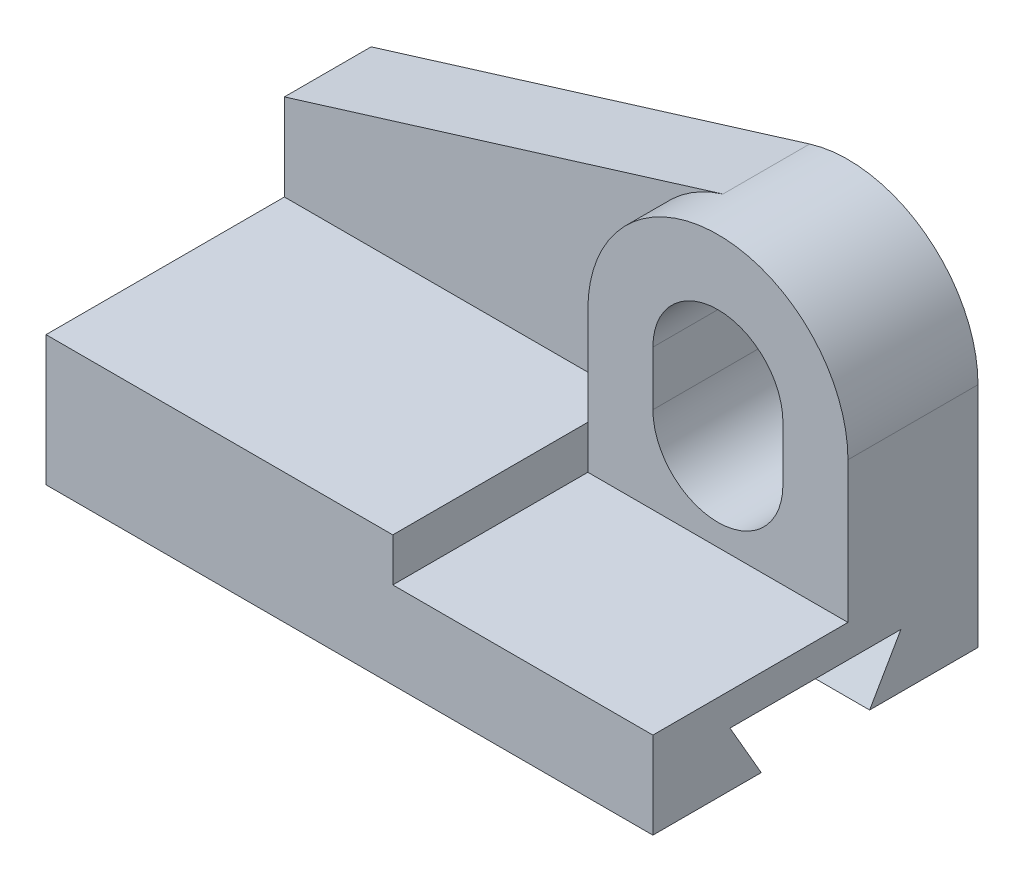
ISO-10303-21;
HEADER;
FILE_DESCRIPTION(('STEP AP214'),'2;1');
FILE_NAME('part.step','',(''),(''),'','','');
FILE_SCHEMA(('AUTOMOTIVE_DESIGN { 1 0 10303 214 1 1 1 1 }'));
ENDSEC;
DATA;
#1=APPLICATION_CONTEXT('core data for automotive mechanical design processes');
#2=APPLICATION_PROTOCOL_DEFINITION('international standard','automotive_design',2000,#1);
#3=PRODUCT_CONTEXT('',#1,'mechanical');
#4=PRODUCT('Part','Part','',(#3));
#5=PRODUCT_RELATED_PRODUCT_CATEGORY('part','',(#4));
#6=PRODUCT_DEFINITION_FORMATION('','',#4);
#7=PRODUCT_DEFINITION_CONTEXT('part definition',#1,'design');
#8=PRODUCT_DEFINITION('design','',#6,#7);
#9=PRODUCT_DEFINITION_SHAPE('','',#8);
#10=(LENGTH_UNIT() NAMED_UNIT(*) SI_UNIT(.MILLI.,.METRE.));
#11=(NAMED_UNIT(*) PLANE_ANGLE_UNIT() SI_UNIT($,.RADIAN.));
#12=(NAMED_UNIT(*) SI_UNIT($,.STERADIAN.) SOLID_ANGLE_UNIT());
#13=UNCERTAINTY_MEASURE_WITH_UNIT(LENGTH_MEASURE(1.E-05),#10,'distance_accuracy_value','');
#14=(GEOMETRIC_REPRESENTATION_CONTEXT(3) GLOBAL_UNCERTAINTY_ASSIGNED_CONTEXT((#13)) GLOBAL_UNIT_ASSIGNED_CONTEXT((#10,
#11,#12)) REPRESENTATION_CONTEXT('',''));
#15=CARTESIAN_POINT('',(0.,0.,0.));
#16=DIRECTION('',(0.,0.,1.));
#17=DIRECTION('',(1.,0.,0.));
#18=AXIS2_PLACEMENT_3D('',#15,#16,#17);
#19=CARTESIAN_POINT('',(0.,-10.,-8.));
#20=DIRECTION('',(0.,1.,0.));
#21=DIRECTION('',(-1.,0.,0.));
#22=AXIS2_PLACEMENT_3D('',#19,#20,#21);
#23=PLANE('',#22);
#24=DIRECTION('',(0.,0.,1.));
#25=VECTOR('',#24,1.);
#26=CARTESIAN_POINT('',(28.4071767656035,-9.99999999999999,-8.));
#27=LINE('',#26,#25);
#28=CARTESIAN_POINT('',(28.4071767656035,-9.99999999999999,-8.));
#29=VERTEX_POINT('',#28);
#30=CARTESIAN_POINT('',(28.4071767656035,-9.99999999999998,2.));
#31=VERTEX_POINT('',#30);
#32=EDGE_CURVE('E47',#29,#31,#27,.T.);
#33=ORIENTED_EDGE('',*,*,#32,.T.);
#34=DIRECTION('',(-1.,0.,0.));
#35=VECTOR('',#34,1.);
#36=CARTESIAN_POINT('',(28.4071767656035,-9.99999999999998,2.));
#37=LINE('',#36,#35);
#38=CARTESIAN_POINT('',(-27.5928232343965,-10.,2.));
#39=VERTEX_POINT('',#38);
#40=EDGE_CURVE('E336',#31,#39,#37,.T.);
#41=ORIENTED_EDGE('',*,*,#40,.T.);
#42=DIRECTION('',(0.,0.,1.));
#43=VECTOR('',#42,1.);
#44=CARTESIAN_POINT('',(-27.5928232343965,-10.,-8.));
#45=LINE('',#44,#43);
#46=CARTESIAN_POINT('',(-27.5928232343965,-10.,-8.));
#47=VERTEX_POINT('',#46);
#48=EDGE_CURVE('E221',#47,#39,#45,.T.);
#49=ORIENTED_EDGE('',*,*,#48,.F.);
#50=DIRECTION('',(-1.,0.,0.));
#51=VECTOR('',#50,1.);
#52=CARTESIAN_POINT('',(0.,-10.,-8.));
#53=LINE('',#52,#51);
#54=EDGE_CURVE('E213',#29,#47,#53,.T.);
#55=ORIENTED_EDGE('',*,*,#54,.F.);
#56=EDGE_LOOP('',(#33,#41,#49,#55));
#57=FACE_BOUND('',#56,.T.);
#58=ADVANCED_FACE('F43',(#57),#23,.F.);
#59=CARTESIAN_POINT('',(0.,0.,0.));
#60=DIRECTION('',(0.,0.,1.));
#61=DIRECTION('',(1.,0.,0.));
#62=AXIS2_PLACEMENT_3D('',#59,#60,#61);
#63=PLANE('',#62);
#64=DIRECTION('',(0.,1.,0.));
#65=VECTOR('',#64,1.);
#66=CARTESIAN_POINT('',(-27.5928232343965,0.,0.));
#67=LINE('',#66,#65);
#68=CARTESIAN_POINT('',(-27.5928232343965,2.,0.));
#69=VERTEX_POINT('',#68);
#70=CARTESIAN_POINT('',(-27.5928232343965,10.,0.));
#71=VERTEX_POINT('',#70);
#72=EDGE_CURVE('E210',#69,#71,#67,.T.);
#73=ORIENTED_EDGE('',*,*,#72,.F.);
#74=DIRECTION('',(-1.,0.,0.));
#75=VECTOR('',#74,1.);
#76=CARTESIAN_POINT('',(0.,2.,0.));
#77=LINE('',#76,#75);
#78=CARTESIAN_POINT('',(4.40717676560348,2.,0.));
#79=VERTEX_POINT('',#78);
#80=EDGE_CURVE('E313',#79,#69,#77,.T.);
#81=ORIENTED_EDGE('',*,*,#80,.F.);
#82=DIRECTION('',(0.,-1.,0.));
#83=VECTOR('',#82,1.);
#84=CARTESIAN_POINT('',(4.40717676560348,0.,0.));
#85=LINE('',#84,#83);
#86=CARTESIAN_POINT('',(4.40717676560348,10.9999999999999,0.));
#87=VERTEX_POINT('',#86);
#88=EDGE_CURVE('E68',#87,#79,#85,.T.);
#89=ORIENTED_EDGE('',*,*,#88,.F.);
#90=CARTESIAN_POINT('',(16.4071767656035,11.,0.));
#91=DIRECTION('',(0.,0.,1.));
#92=DIRECTION('',(1.,0.,0.));
#93=AXIS2_PLACEMENT_3D('',#90,#91,#92);
#94=CIRCLE('',#93,12.);
#95=CARTESIAN_POINT('',(12.8738128169025,22.4680137428423,0.));
#96=VERTEX_POINT('',#95);
#97=EDGE_CURVE('E11',#96,#87,#94,.T.);
#98=ORIENTED_EDGE('',*,*,#97,.F.);
#99=DIRECTION('',(0.955667811903527,0.29444699572508,0.));
#100=VECTOR('',#99,1.);
#101=CARTESIAN_POINT('',(-5.20620626146767,16.897451216859,0.));
#102=LINE('',#101,#100);
#103=EDGE_CURVE('E207',#71,#96,#102,.T.);
#104=ORIENTED_EDGE('',*,*,#103,.F.);
#105=EDGE_LOOP('',(#73,#81,#89,#98,#104));
#106=FACE_BOUND('',#105,.T.);
#107=ADVANCED_FACE('F358',(#106),#63,.T.);
#108=CARTESIAN_POINT('',(4.40717676560348,0.,4.));
#109=DIRECTION('',(1.,0.,0.));
#110=DIRECTION('',(0.,0.,-1.));
#111=AXIS2_PLACEMENT_3D('',#108,#109,#110);
#112=PLANE('',#111);
#113=DIRECTION('',(0.,0.,-1.));
#114=VECTOR('',#113,1.);
#115=CARTESIAN_POINT('',(4.40717676560348,2.,22.));
#116=LINE('',#115,#114);
#117=CARTESIAN_POINT('',(4.40717676560348,2.,4.));
#118=VERTEX_POINT('',#117);
#119=EDGE_CURVE('E304',#118,#79,#116,.T.);
#120=ORIENTED_EDGE('',*,*,#119,.F.);
#121=DIRECTION('',(0.,-1.,0.));
#122=VECTOR('',#121,1.);
#123=CARTESIAN_POINT('',(4.40717676560348,0.,4.));
#124=LINE('',#123,#122);
#125=CARTESIAN_POINT('',(4.40717676560348,10.9999999999999,4.));
#126=VERTEX_POINT('',#125);
#127=EDGE_CURVE('E254',#126,#118,#124,.T.);
#128=ORIENTED_EDGE('',*,*,#127,.F.);
#129=DIRECTION('',(0.,0.,-1.));
#130=VECTOR('',#129,1.);
#131=CARTESIAN_POINT('',(4.40717676560348,10.9999999999999,4.));
#132=LINE('',#131,#130);
#133=EDGE_CURVE('E211',#126,#87,#132,.T.);
#134=ORIENTED_EDGE('',*,*,#133,.T.);
#135=ORIENTED_EDGE('',*,*,#88,.T.);
#136=EDGE_LOOP('',(#120,#128,#134,#135));
#137=FACE_BOUND('',#136,.T.);
#138=ADVANCED_FACE('F368',(#137),#112,.F.);
#139=CARTESIAN_POINT('',(16.4071767656035,6.,-8.));
#140=DIRECTION('',(0.,0.,1.));
#141=DIRECTION('',(1.,0.,0.));
#142=AXIS2_PLACEMENT_3D('',#139,#140,#141);
#143=CYLINDRICAL_SURFACE('',#142,6.);
#144=DIRECTION('',(0.,0.,1.));
#145=VECTOR('',#144,1.);
#146=CARTESIAN_POINT('',(10.4071767656035,6.,-8.));
#147=LINE('',#146,#145);
#148=CARTESIAN_POINT('',(10.4071767656035,6.,-8.));
#149=VERTEX_POINT('',#148);
#150=CARTESIAN_POINT('',(10.4071767656035,6.,4.));
#151=VERTEX_POINT('',#150);
#152=EDGE_CURVE('E219',#149,#151,#147,.T.);
#153=ORIENTED_EDGE('',*,*,#152,.T.);
#154=CARTESIAN_POINT('',(16.4071767656035,6.,4.));
#155=DIRECTION('',(0.,0.,1.));
#156=DIRECTION('',(1.,0.,0.));
#157=AXIS2_PLACEMENT_3D('',#154,#155,#156);
#158=CIRCLE('',#157,6.);
#159=CARTESIAN_POINT('',(22.4071767656035,6.,4.));
#160=VERTEX_POINT('',#159);
#161=EDGE_CURVE('E263',#151,#160,#158,.T.);
#162=ORIENTED_EDGE('',*,*,#161,.T.);
#163=DIRECTION('',(0.,0.,1.));
#164=VECTOR('',#163,1.);
#165=CARTESIAN_POINT('',(22.4071767656035,6.,-8.));
#166=LINE('',#165,#164);
#167=CARTESIAN_POINT('',(22.4071767656035,6.,-8.));
#168=VERTEX_POINT('',#167);
#169=EDGE_CURVE('E52',#168,#160,#166,.T.);
#170=ORIENTED_EDGE('',*,*,#169,.F.);
#171=CARTESIAN_POINT('',(16.4071767656035,6.,-8.));
#172=DIRECTION('',(0.,0.,1.));
#173=DIRECTION('',(1.,0.,0.));
#174=AXIS2_PLACEMENT_3D('',#171,#172,#173);
#175=CIRCLE('',#174,6.);
#176=EDGE_CURVE('E275',#149,#168,#175,.T.);
#177=ORIENTED_EDGE('',*,*,#176,.F.);
#178=EDGE_LOOP('',(#153,#162,#170,#177));
#179=FACE_BOUND('',#178,.T.);
#180=ADVANCED_FACE('F292',(#179),#143,.F.);
#181=CARTESIAN_POINT('',(22.4071767656035,0.,-8.));
#182=DIRECTION('',(-1.,0.,0.));
#183=DIRECTION('',(0.,-1.,0.));
#184=AXIS2_PLACEMENT_3D('',#181,#182,#183);
#185=PLANE('',#184);
#186=ORIENTED_EDGE('',*,*,#169,.T.);
#187=DIRECTION('',(0.,-1.,0.));
#188=VECTOR('',#187,1.);
#189=CARTESIAN_POINT('',(22.4071767656035,0.,4.));
#190=LINE('',#189,#188);
#191=CARTESIAN_POINT('',(22.4071767656035,11.,4.));
#192=VERTEX_POINT('',#191);
#193=EDGE_CURVE('E252',#192,#160,#190,.T.);
#194=ORIENTED_EDGE('',*,*,#193,.F.);
#195=DIRECTION('',(0.,0.,1.));
#196=VECTOR('',#195,1.);
#197=CARTESIAN_POINT('',(22.4071767656035,11.,-8.));
#198=LINE('',#197,#196);
#199=CARTESIAN_POINT('',(22.4071767656035,11.,-8.));
#200=VERTEX_POINT('',#199);
#201=EDGE_CURVE('E215',#200,#192,#198,.T.);
#202=ORIENTED_EDGE('',*,*,#201,.F.);
#203=DIRECTION('',(0.,-1.,0.));
#204=VECTOR('',#203,1.);
#205=CARTESIAN_POINT('',(22.4071767656035,0.,-8.));
#206=LINE('',#205,#204);
#207=EDGE_CURVE('E195',#200,#168,#206,.T.);
#208=ORIENTED_EDGE('',*,*,#207,.T.);
#209=EDGE_LOOP('',(#186,#194,#202,#208));
#210=FACE_BOUND('',#209,.T.);
#211=ADVANCED_FACE('F294',(#210),#185,.T.);
#212=CARTESIAN_POINT('',(16.4071767656035,11.,-8.));
#213=DIRECTION('',(0.,0.,1.));
#214=DIRECTION('',(1.,0.,0.));
#215=AXIS2_PLACEMENT_3D('',#212,#213,#214);
#216=CYLINDRICAL_SURFACE('',#215,6.00000000000001);
#217=ORIENTED_EDGE('',*,*,#201,.T.);
#218=CARTESIAN_POINT('',(16.4071767656035,11.,4.));
#219=DIRECTION('',(0.,0.,1.));
#220=DIRECTION('',(1.,0.,0.));
#221=AXIS2_PLACEMENT_3D('',#218,#219,#220);
#222=CIRCLE('',#221,6.00000000000001);
#223=CARTESIAN_POINT('',(10.4071767656035,11.,4.));
#224=VERTEX_POINT('',#223);
#225=EDGE_CURVE('E257',#192,#224,#222,.T.);
#226=ORIENTED_EDGE('',*,*,#225,.T.);
#227=DIRECTION('',(0.,0.,1.));
#228=VECTOR('',#227,1.);
#229=CARTESIAN_POINT('',(10.4071767656035,11.,-8.));
#230=LINE('',#229,#228);
#231=CARTESIAN_POINT('',(10.4071767656035,11.,-8.));
#232=VERTEX_POINT('',#231);
#233=EDGE_CURVE('E217',#232,#224,#230,.T.);
#234=ORIENTED_EDGE('',*,*,#233,.F.);
#235=CARTESIAN_POINT('',(16.4071767656035,11.,-8.));
#236=DIRECTION('',(0.,0.,1.));
#237=DIRECTION('',(1.,0.,0.));
#238=AXIS2_PLACEMENT_3D('',#235,#236,#237);
#239=CIRCLE('',#238,6.00000000000001);
#240=EDGE_CURVE('E199',#200,#232,#239,.T.);
#241=ORIENTED_EDGE('',*,*,#240,.F.);
#242=EDGE_LOOP('',(#217,#226,#234,#241));
#243=FACE_BOUND('',#242,.T.);
#244=ADVANCED_FACE('F394',(#243),#216,.F.);
#245=CARTESIAN_POINT('',(-27.5928232343965,-10.,12.));
#246=VERTEX_POINT('',#245);
#247=CARTESIAN_POINT('',(-27.5928232343965,-10.,22.));
#248=VERTEX_POINT('',#247);
#249=EDGE_CURVE('E187',#246,#248,#45,.T.);
#250=ORIENTED_EDGE('',*,*,#249,.F.);
#251=DIRECTION('',(-1.,0.,0.));
#252=VECTOR('',#251,1.);
#253=CARTESIAN_POINT('',(28.4071767656035,-9.99999999999998,12.));
#254=LINE('',#253,#252);
#255=CARTESIAN_POINT('',(28.4071767656035,-9.99999999999998,12.));
#256=VERTEX_POINT('',#255);
#257=EDGE_CURVE('E176',#256,#246,#254,.T.);
#258=ORIENTED_EDGE('',*,*,#257,.F.);
#259=CARTESIAN_POINT('',(28.4071767656035,-9.99999999999999,22.));
#260=VERTEX_POINT('',#259);
#261=EDGE_CURVE('E185',#256,#260,#27,.T.);
#262=ORIENTED_EDGE('',*,*,#261,.T.);
#263=DIRECTION('',(-1.,0.,0.));
#264=VECTOR('',#263,1.);
#265=CARTESIAN_POINT('',(0.,-10.,22.));
#266=LINE('',#265,#264);
#267=EDGE_CURVE('E321',#260,#248,#266,.T.);
#268=ORIENTED_EDGE('',*,*,#267,.T.);
#269=EDGE_LOOP('',(#250,#258,#262,#268));
#270=FACE_BOUND('',#269,.T.);
#271=ADVANCED_FACE('F45',(#270),#23,.F.);
#272=CARTESIAN_POINT('',(-27.5928232343965,0.,-8.));
#273=DIRECTION('',(1.,0.,0.));
#274=DIRECTION('',(0.,1.,0.));
#275=AXIS2_PLACEMENT_3D('',#272,#273,#274);
#276=PLANE('',#275);
#277=ORIENTED_EDGE('',*,*,#48,.T.);
#278=DIRECTION('',(0.,0.866025403784436,-0.500000000000004));
#279=VECTOR('',#278,1.);
#280=CARTESIAN_POINT('',(-27.5928232343965,1.83012701892217,-4.83012701892226));
#281=LINE('',#280,#279);
#282=CARTESIAN_POINT('',(-27.5928232343965,-5.,-0.886751345948162));
#283=VERTEX_POINT('',#282);
#284=EDGE_CURVE('E317',#39,#283,#281,.T.);
#285=ORIENTED_EDGE('',*,*,#284,.T.);
#286=DIRECTION('',(0.,0.,1.));
#287=VECTOR('',#286,1.);
#288=CARTESIAN_POINT('',(-27.5928232343965,-5.,-8.));
#289=LINE('',#288,#287);
#290=CARTESIAN_POINT('',(-27.5928232343965,-5.,14.8867513459482));
#291=VERTEX_POINT('',#290);
#292=EDGE_CURVE('E332',#283,#291,#289,.T.);
#293=ORIENTED_EDGE('',*,*,#292,.T.);
#294=DIRECTION('',(0.,-0.866025403784436,-0.500000000000004));
#295=VECTOR('',#294,1.);
#296=CARTESIAN_POINT('',(-27.5928232343965,-11.1602540378445,11.3301270189221));
#297=LINE('',#296,#295);
#298=EDGE_CURVE('E335',#291,#246,#297,.T.);
#299=ORIENTED_EDGE('',*,*,#298,.T.);
#300=ORIENTED_EDGE('',*,*,#249,.T.);
#301=DIRECTION('',(0.,1.,0.));
#302=VECTOR('',#301,1.);
#303=CARTESIAN_POINT('',(-27.5928232343965,0.,22.));
#304=LINE('',#303,#302);
#305=CARTESIAN_POINT('',(-27.5928232343965,2.,22.));
#306=VERTEX_POINT('',#305);
#307=EDGE_CURVE('E323',#248,#306,#304,.T.);
#308=ORIENTED_EDGE('',*,*,#307,.T.);
#309=DIRECTION('',(0.,0.,-1.));
#310=VECTOR('',#309,1.);
#311=CARTESIAN_POINT('',(-27.5928232343965,2.,22.));
#312=LINE('',#311,#310);
#313=EDGE_CURVE('E305',#306,#69,#312,.T.);
#314=ORIENTED_EDGE('',*,*,#313,.T.);
#315=ORIENTED_EDGE('',*,*,#72,.T.);
#316=DIRECTION('',(0.,0.,1.));
#317=VECTOR('',#316,1.);
#318=CARTESIAN_POINT('',(-27.5928232343965,10.,-8.));
#319=LINE('',#318,#317);
#320=CARTESIAN_POINT('',(-27.5928232343965,10.,-8.));
#321=VERTEX_POINT('',#320);
#322=EDGE_CURVE('E224',#321,#71,#319,.T.);
#323=ORIENTED_EDGE('',*,*,#322,.F.);
#324=DIRECTION('',(0.,1.,0.));
#325=VECTOR('',#324,1.);
#326=CARTESIAN_POINT('',(-27.5928232343965,0.,-8.));
#327=LINE('',#326,#325);
#328=EDGE_CURVE('E273',#47,#321,#327,.T.);
#329=ORIENTED_EDGE('',*,*,#328,.F.);
#330=EDGE_LOOP('',(#277,#285,#293,#299,#300,#308,#314,#315,#323,#329));
#331=FACE_BOUND('',#330,.T.);
#332=ADVANCED_FACE('F360',(#331),#276,.F.);
#333=CARTESIAN_POINT('',(-5.20620626146767,16.897451216859,-8.));
#334=DIRECTION('',(0.29444699572508,-0.955667811903527,0.));
#335=DIRECTION('',(0.955667811903527,0.29444699572508,0.));
#336=AXIS2_PLACEMENT_3D('',#333,#334,#335);
#337=PLANE('',#336);
#338=ORIENTED_EDGE('',*,*,#103,.T.);
#339=DIRECTION('',(0.,0.,1.));
#340=VECTOR('',#339,1.);
#341=CARTESIAN_POINT('',(12.8738128169025,22.4680137428423,-8.));
#342=LINE('',#341,#340);
#343=CARTESIAN_POINT('',(12.8738128169025,22.4680137428423,-8.));
#344=VERTEX_POINT('',#343);
#345=EDGE_CURVE('E227',#344,#96,#342,.T.);
#346=ORIENTED_EDGE('',*,*,#345,.F.);
#347=DIRECTION('',(0.955667811903527,0.29444699572508,0.));
#348=VECTOR('',#347,1.);
#349=CARTESIAN_POINT('',(-5.20620626146767,16.897451216859,-8.));
#350=LINE('',#349,#348);
#351=EDGE_CURVE('E271',#321,#344,#350,.T.);
#352=ORIENTED_EDGE('',*,*,#351,.F.);
#353=ORIENTED_EDGE('',*,*,#322,.T.);
#354=EDGE_LOOP('',(#338,#346,#352,#353));
#355=FACE_BOUND('',#354,.T.);
#356=ADVANCED_FACE('F355',(#355),#337,.F.);
#357=CARTESIAN_POINT('',(16.4071767656035,11.,-8.));
#358=DIRECTION('',(0.,0.,1.));
#359=DIRECTION('',(1.,0.,0.));
#360=AXIS2_PLACEMENT_3D('',#357,#358,#359);
#361=CYLINDRICAL_SURFACE('',#360,12.);
#362=ORIENTED_EDGE('',*,*,#345,.T.);
#363=ORIENTED_EDGE('',*,*,#97,.T.);
#364=ORIENTED_EDGE('',*,*,#133,.F.);
#365=CARTESIAN_POINT('',(16.4071767656035,11.,4.));
#366=DIRECTION('',(0.,0.,1.));
#367=DIRECTION('',(1.,0.,0.));
#368=AXIS2_PLACEMENT_3D('',#365,#366,#367);
#369=CIRCLE('',#368,12.);
#370=CARTESIAN_POINT('',(28.4071767656035,11.,4.));
#371=VERTEX_POINT('',#370);
#372=EDGE_CURVE('E244',#371,#126,#369,.T.);
#373=ORIENTED_EDGE('',*,*,#372,.F.);
#374=DIRECTION('',(0.,0.,1.));
#375=VECTOR('',#374,1.);
#376=CARTESIAN_POINT('',(28.4071767656035,11.,-8.));
#377=LINE('',#376,#375);
#378=CARTESIAN_POINT('',(28.4071767656035,11.,-8.));
#379=VERTEX_POINT('',#378);
#380=EDGE_CURVE('E197',#379,#371,#377,.T.);
#381=ORIENTED_EDGE('',*,*,#380,.F.);
#382=CARTESIAN_POINT('',(16.4071767656035,11.,-8.));
#383=DIRECTION('',(0.,0.,1.));
#384=DIRECTION('',(1.,0.,0.));
#385=AXIS2_PLACEMENT_3D('',#382,#383,#384);
#386=CIRCLE('',#385,12.);
#387=EDGE_CURVE('E269',#379,#344,#386,.T.);
#388=ORIENTED_EDGE('',*,*,#387,.T.);
#389=EDGE_LOOP('',(#362,#363,#364,#373,#381,#388));
#390=FACE_BOUND('',#389,.T.);
#391=ADVANCED_FACE('F249',(#390),#361,.T.);
#392=CARTESIAN_POINT('',(28.4071767656035,0.,-8.));
#393=DIRECTION('',(1.,0.,0.));
#394=DIRECTION('',(0.,1.,0.));
#395=AXIS2_PLACEMENT_3D('',#392,#393,#394);
#396=PLANE('',#395);
#397=DIRECTION('',(0.,-0.866025403784436,0.500000000000004));
#398=VECTOR('',#397,1.);
#399=CARTESIAN_POINT('',(28.4071767656035,-9.99999999999998,2.));
#400=LINE('',#399,#398);
#401=CARTESIAN_POINT('',(28.4071767656035,-4.99999999999998,-0.886751345948162));
#402=VERTEX_POINT('',#401);
#403=EDGE_CURVE('E188',#402,#31,#400,.T.);
#404=ORIENTED_EDGE('',*,*,#403,.T.);
#405=ORIENTED_EDGE('',*,*,#32,.F.);
#406=DIRECTION('',(0.,1.,0.));
#407=VECTOR('',#406,1.);
#408=CARTESIAN_POINT('',(28.4071767656035,0.,-8.));
#409=LINE('',#408,#407);
#410=EDGE_CURVE('E234',#29,#379,#409,.T.);
#411=ORIENTED_EDGE('',*,*,#410,.T.);
#412=ORIENTED_EDGE('',*,*,#380,.T.);
#413=DIRECTION('',(0.,1.,0.));
#414=VECTOR('',#413,1.);
#415=CARTESIAN_POINT('',(28.4071767656035,0.,4.));
#416=LINE('',#415,#414);
#417=CARTESIAN_POINT('',(28.4071767656035,-2.00000000000008,4.));
#418=VERTEX_POINT('',#417);
#419=EDGE_CURVE('E232',#418,#371,#416,.T.);
#420=ORIENTED_EDGE('',*,*,#419,.F.);
#421=DIRECTION('',(0.,0.,-1.));
#422=VECTOR('',#421,1.);
#423=CARTESIAN_POINT('',(28.4071767656035,-2.00000000000008,22.));
#424=LINE('',#423,#422);
#425=CARTESIAN_POINT('',(28.4071767656035,-2.00000000000008,22.));
#426=VERTEX_POINT('',#425);
#427=EDGE_CURVE('E307',#426,#418,#424,.T.);
#428=ORIENTED_EDGE('',*,*,#427,.F.);
#429=DIRECTION('',(0.,1.,0.));
#430=VECTOR('',#429,1.);
#431=CARTESIAN_POINT('',(28.4071767656035,0.,22.));
#432=LINE('',#431,#430);
#433=EDGE_CURVE('E193',#260,#426,#432,.T.);
#434=ORIENTED_EDGE('',*,*,#433,.F.);
#435=ORIENTED_EDGE('',*,*,#261,.F.);
#436=DIRECTION('',(0.,0.866025403784436,0.500000000000004));
#437=VECTOR('',#436,1.);
#438=CARTESIAN_POINT('',(28.4071767656035,-9.99999999999998,12.));
#439=LINE('',#438,#437);
#440=CARTESIAN_POINT('',(28.4071767656035,-4.99999999999998,14.8867513459482));
#441=VERTEX_POINT('',#440);
#442=EDGE_CURVE('E173',#256,#441,#439,.T.);
#443=ORIENTED_EDGE('',*,*,#442,.T.);
#444=DIRECTION('',(0.,0.,-1.));
#445=VECTOR('',#444,1.);
#446=CARTESIAN_POINT('',(28.4071767656035,-4.99999999999998,-0.886751345948162));
#447=LINE('',#446,#445);
#448=EDGE_CURVE('E60',#441,#402,#447,.T.);
#449=ORIENTED_EDGE('',*,*,#448,.T.);
#450=EDGE_LOOP('',(#404,#405,#411,#412,#420,#428,#434,#435,#443,#449));
#451=FACE_BOUND('',#450,.T.);
#452=ADVANCED_FACE('F191',(#451),#396,.T.);
#453=CARTESIAN_POINT('',(10.4071767656035,0.,-8.));
#454=DIRECTION('',(-1.,0.,0.));
#455=DIRECTION('',(0.,-1.,0.));
#456=AXIS2_PLACEMENT_3D('',#453,#454,#455);
#457=PLANE('',#456);
#458=ORIENTED_EDGE('',*,*,#233,.T.);
#459=DIRECTION('',(0.,-1.,0.));
#460=VECTOR('',#459,1.);
#461=CARTESIAN_POINT('',(10.4071767656035,0.,4.));
#462=LINE('',#461,#460);
#463=EDGE_CURVE('E288',#224,#151,#462,.T.);
#464=ORIENTED_EDGE('',*,*,#463,.T.);
#465=ORIENTED_EDGE('',*,*,#152,.F.);
#466=DIRECTION('',(0.,-1.,0.));
#467=VECTOR('',#466,1.);
#468=CARTESIAN_POINT('',(10.4071767656035,0.,-8.));
#469=LINE('',#468,#467);
#470=EDGE_CURVE('E203',#232,#149,#469,.T.);
#471=ORIENTED_EDGE('',*,*,#470,.F.);
#472=EDGE_LOOP('',(#458,#464,#465,#471));
#473=FACE_BOUND('',#472,.T.);
#474=ADVANCED_FACE('F286',(#473),#457,.F.);
#475=CARTESIAN_POINT('',(0.,0.,-8.));
#476=DIRECTION('',(0.,0.,1.));
#477=DIRECTION('',(1.,0.,0.));
#478=AXIS2_PLACEMENT_3D('',#475,#476,#477);
#479=PLANE('',#478);
#480=ORIENTED_EDGE('',*,*,#54,.T.);
#481=ORIENTED_EDGE('',*,*,#328,.T.);
#482=ORIENTED_EDGE('',*,*,#351,.T.);
#483=ORIENTED_EDGE('',*,*,#387,.F.);
#484=ORIENTED_EDGE('',*,*,#410,.F.);
#485=EDGE_LOOP('',(#480,#481,#482,#483,#484));
#486=FACE_BOUND('',#485,.T.);
#487=ORIENTED_EDGE('',*,*,#176,.T.);
#488=ORIENTED_EDGE('',*,*,#207,.F.);
#489=ORIENTED_EDGE('',*,*,#240,.T.);
#490=ORIENTED_EDGE('',*,*,#470,.T.);
#491=EDGE_LOOP('',(#487,#488,#489,#490));
#492=FACE_BOUND('',#491,.T.);
#493=ADVANCED_FACE('F279',(#486,#492),#479,.F.);
#494=CARTESIAN_POINT('',(0.,0.,4.));
#495=DIRECTION('',(0.,0.,1.));
#496=DIRECTION('',(1.,0.,0.));
#497=AXIS2_PLACEMENT_3D('',#494,#495,#496);
#498=PLANE('',#497);
#499=ORIENTED_EDGE('',*,*,#161,.F.);
#500=ORIENTED_EDGE('',*,*,#463,.F.);
#501=ORIENTED_EDGE('',*,*,#225,.F.);
#502=ORIENTED_EDGE('',*,*,#193,.T.);
#503=EDGE_LOOP('',(#499,#500,#501,#502));
#504=FACE_BOUND('',#503,.T.);
#505=ORIENTED_EDGE('',*,*,#372,.T.);
#506=ORIENTED_EDGE('',*,*,#127,.T.);
#507=CARTESIAN_POINT('',(4.40717676560348,-2.00000000000008,4.));
#508=VERTEX_POINT('',#507);
#509=EDGE_CURVE('E251',#118,#508,#124,.T.);
#510=ORIENTED_EDGE('',*,*,#509,.T.);
#511=DIRECTION('',(1.,0.,0.));
#512=VECTOR('',#511,1.);
#513=CARTESIAN_POINT('',(0.,-2.00000000000008,4.));
#514=LINE('',#513,#512);
#515=EDGE_CURVE('E247',#508,#418,#514,.T.);
#516=ORIENTED_EDGE('',*,*,#515,.T.);
#517=ORIENTED_EDGE('',*,*,#419,.T.);
#518=EDGE_LOOP('',(#505,#506,#510,#516,#517));
#519=FACE_BOUND('',#518,.T.);
#520=ADVANCED_FACE('F242',(#504,#519),#498,.T.);
#521=CARTESIAN_POINT('',(4.40717676560348,0.,22.));
#522=DIRECTION('',(1.,0.,0.));
#523=DIRECTION('',(0.,0.,-1.));
#524=AXIS2_PLACEMENT_3D('',#521,#522,#523);
#525=PLANE('',#524);
#526=DIRECTION('',(0.,0.,-1.));
#527=VECTOR('',#526,1.);
#528=CARTESIAN_POINT('',(4.40717676560348,-2.00000000000008,22.));
#529=LINE('',#528,#527);
#530=CARTESIAN_POINT('',(4.40717676560348,-2.00000000000008,22.));
#531=VERTEX_POINT('',#530);
#532=EDGE_CURVE('E309',#531,#508,#529,.T.);
#533=ORIENTED_EDGE('',*,*,#532,.T.);
#534=ORIENTED_EDGE('',*,*,#509,.F.);
#535=CARTESIAN_POINT('',(4.40717676560348,2.,22.));
#536=VERTEX_POINT('',#535);
#537=EDGE_CURVE('E264',#536,#118,#116,.T.);
#538=ORIENTED_EDGE('',*,*,#537,.F.);
#539=DIRECTION('',(0.,-1.,0.));
#540=VECTOR('',#539,1.);
#541=CARTESIAN_POINT('',(4.40717676560348,0.,22.));
#542=LINE('',#541,#540);
#543=EDGE_CURVE('E316',#536,#531,#542,.T.);
#544=ORIENTED_EDGE('',*,*,#543,.T.);
#545=EDGE_LOOP('',(#533,#534,#538,#544));
#546=FACE_BOUND('',#545,.T.);
#547=ADVANCED_FACE('F370',(#546),#525,.T.);
#548=CARTESIAN_POINT('',(0.,2.,22.));
#549=DIRECTION('',(0.,-1.,0.));
#550=DIRECTION('',(1.,0.,0.));
#551=AXIS2_PLACEMENT_3D('',#548,#549,#550);
#552=PLANE('',#551);
#553=ORIENTED_EDGE('',*,*,#80,.T.);
#554=ORIENTED_EDGE('',*,*,#313,.F.);
#555=DIRECTION('',(-1.,0.,0.));
#556=VECTOR('',#555,1.);
#557=CARTESIAN_POINT('',(0.,2.,22.));
#558=LINE('',#557,#556);
#559=EDGE_CURVE('E326',#536,#306,#558,.T.);
#560=ORIENTED_EDGE('',*,*,#559,.F.);
#561=ORIENTED_EDGE('',*,*,#537,.T.);
#562=ORIENTED_EDGE('',*,*,#119,.T.);
#563=EDGE_LOOP('',(#553,#554,#560,#561,#562));
#564=FACE_BOUND('',#563,.T.);
#565=ADVANCED_FACE('F365',(#564),#552,.F.);
#566=CARTESIAN_POINT('',(0.,-2.00000000000008,22.));
#567=DIRECTION('',(0.,1.,0.));
#568=DIRECTION('',(0.,0.,1.));
#569=AXIS2_PLACEMENT_3D('',#566,#567,#568);
#570=PLANE('',#569);
#571=ORIENTED_EDGE('',*,*,#427,.T.);
#572=ORIENTED_EDGE('',*,*,#515,.F.);
#573=ORIENTED_EDGE('',*,*,#532,.F.);
#574=DIRECTION('',(1.,0.,0.));
#575=VECTOR('',#574,1.);
#576=CARTESIAN_POINT('',(0.,-2.00000000000008,22.));
#577=LINE('',#576,#575);
#578=EDGE_CURVE('E312',#531,#426,#577,.T.);
#579=ORIENTED_EDGE('',*,*,#578,.T.);
#580=EDGE_LOOP('',(#571,#572,#573,#579));
#581=FACE_BOUND('',#580,.T.);
#582=ADVANCED_FACE('F374',(#581),#570,.T.);
#583=CARTESIAN_POINT('',(0.,0.,22.));
#584=DIRECTION('',(0.,0.,1.));
#585=DIRECTION('',(1.,0.,0.));
#586=AXIS2_PLACEMENT_3D('',#583,#584,#585);
#587=PLANE('',#586);
#588=ORIENTED_EDGE('',*,*,#543,.F.);
#589=ORIENTED_EDGE('',*,*,#559,.T.);
#590=ORIENTED_EDGE('',*,*,#307,.F.);
#591=ORIENTED_EDGE('',*,*,#267,.F.);
#592=ORIENTED_EDGE('',*,*,#433,.T.);
#593=ORIENTED_EDGE('',*,*,#578,.F.);
#594=EDGE_LOOP('',(#588,#589,#590,#591,#592,#593));
#595=FACE_BOUND('',#594,.T.);
#596=ADVANCED_FACE('F376',(#595),#587,.T.);
#597=CARTESIAN_POINT('',(28.4071767656035,-9.99999999999998,2.));
#598=DIRECTION('',(0.,-0.500000000000004,-0.866025403784436));
#599=DIRECTION('',(0.,0.866025403784436,-0.500000000000004));
#600=AXIS2_PLACEMENT_3D('',#597,#598,#599);
#601=PLANE('',#600);
#602=ORIENTED_EDGE('',*,*,#40,.F.);
#603=ORIENTED_EDGE('',*,*,#403,.F.);
#604=DIRECTION('',(-1.,0.,0.));
#605=VECTOR('',#604,1.);
#606=CARTESIAN_POINT('',(28.4071767656035,-4.99999999999998,-0.886751345948162));
#607=LINE('',#606,#605);
#608=EDGE_CURVE('E339',#402,#283,#607,.T.);
#609=ORIENTED_EDGE('',*,*,#608,.T.);
#610=ORIENTED_EDGE('',*,*,#284,.F.);
#611=EDGE_LOOP('',(#602,#603,#609,#610));
#612=FACE_BOUND('',#611,.T.);
#613=ADVANCED_FACE('F378',(#612),#601,.F.);
#614=CARTESIAN_POINT('',(28.4071767656035,-4.99999999999998,-0.886751345948162));
#615=DIRECTION('',(0.,1.,0.));
#616=DIRECTION('',(-1.,0.,0.));
#617=AXIS2_PLACEMENT_3D('',#614,#615,#616);
#618=PLANE('',#617);
#619=ORIENTED_EDGE('',*,*,#608,.F.);
#620=ORIENTED_EDGE('',*,*,#448,.F.);
#621=DIRECTION('',(-1.,0.,0.));
#622=VECTOR('',#621,1.);
#623=CARTESIAN_POINT('',(28.4071767656035,-4.99999999999998,14.8867513459482));
#624=LINE('',#623,#622);
#625=EDGE_CURVE('E178',#441,#291,#624,.T.);
#626=ORIENTED_EDGE('',*,*,#625,.T.);
#627=ORIENTED_EDGE('',*,*,#292,.F.);
#628=EDGE_LOOP('',(#619,#620,#626,#627));
#629=FACE_BOUND('',#628,.T.);
#630=ADVANCED_FACE('F385',(#629),#618,.F.);
#631=CARTESIAN_POINT('',(28.4071767656035,-9.99999999999998,12.));
#632=DIRECTION('',(0.,-0.500000000000004,0.866025403784436));
#633=DIRECTION('',(0.,-0.866025403784436,-0.500000000000004));
#634=AXIS2_PLACEMENT_3D('',#631,#632,#633);
#635=PLANE('',#634);
#636=ORIENTED_EDGE('',*,*,#625,.F.);
#637=ORIENTED_EDGE('',*,*,#442,.F.);
#638=ORIENTED_EDGE('',*,*,#257,.T.);
#639=ORIENTED_EDGE('',*,*,#298,.F.);
#640=EDGE_LOOP('',(#636,#637,#638,#639));
#641=FACE_BOUND('',#640,.T.);
#642=ADVANCED_FACE('F175',(#641),#635,.F.);
#643=CLOSED_SHELL('',(#58,#107,#138,#180,#211,#244,#271,#332,#356,#391,#452,#474,#493,#520,#547,
#565,#582,#596,#613,#630,#642));
#644=MANIFOLD_SOLID_BREP('B2',#643);
#645=ADVANCED_BREP_SHAPE_REPRESENTATION('',(#18,#644),#14);
#646=SHAPE_DEFINITION_REPRESENTATION(#9,#645);
ENDSEC;
END-ISO-10303-21;
